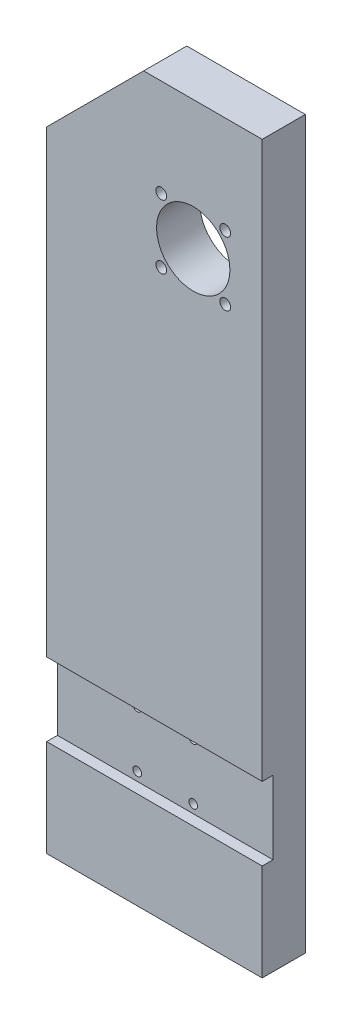
ISO-10303-21;
HEADER;
FILE_DESCRIPTION(('STEP AP214'),'2;1');
FILE_NAME('part.step','',(''),(''),'','','');
FILE_SCHEMA(('AUTOMOTIVE_DESIGN { 1 0 10303 214 1 1 1 1 }'));
ENDSEC;
DATA;
#1=APPLICATION_CONTEXT('core data for automotive mechanical design processes');
#2=APPLICATION_PROTOCOL_DEFINITION('international standard','automotive_design',2000,#1);
#3=PRODUCT_CONTEXT('',#1,'mechanical');
#4=PRODUCT('Part','Part','',(#3));
#5=PRODUCT_RELATED_PRODUCT_CATEGORY('part','',(#4));
#6=PRODUCT_DEFINITION_FORMATION('','',#4);
#7=PRODUCT_DEFINITION_CONTEXT('part definition',#1,'design');
#8=PRODUCT_DEFINITION('design','',#6,#7);
#9=PRODUCT_DEFINITION_SHAPE('','',#8);
#10=(LENGTH_UNIT() NAMED_UNIT(*) SI_UNIT(.MILLI.,.METRE.));
#11=(NAMED_UNIT(*) PLANE_ANGLE_UNIT() SI_UNIT($,.RADIAN.));
#12=(NAMED_UNIT(*) SI_UNIT($,.STERADIAN.) SOLID_ANGLE_UNIT());
#13=UNCERTAINTY_MEASURE_WITH_UNIT(LENGTH_MEASURE(1.E-05),#10,'distance_accuracy_value','');
#14=(GEOMETRIC_REPRESENTATION_CONTEXT(3) GLOBAL_UNCERTAINTY_ASSIGNED_CONTEXT((#13)) GLOBAL_UNIT_ASSIGNED_CONTEXT((#10,
#11,#12)) REPRESENTATION_CONTEXT('',''));
#15=CARTESIAN_POINT('',(0.,0.,0.));
#16=DIRECTION('',(0.,0.,1.));
#17=DIRECTION('',(1.,0.,0.));
#18=AXIS2_PLACEMENT_3D('',#15,#16,#17);
#19=CARTESIAN_POINT('',(0.,0.,20.));
#20=DIRECTION('',(0.,0.,1.));
#21=DIRECTION('',(1.,0.,0.));
#22=AXIS2_PLACEMENT_3D('',#19,#20,#21);
#23=PLANE('',#22);
#24=DIRECTION('',(-1.,0.,0.));
#25=VECTOR('',#24,1.);
#26=CARTESIAN_POINT('',(97.704546062029,362.500370418681,20.));
#27=LINE('',#26,#25);
#28=CARTESIAN_POINT('',(97.704546062029,362.500370418681,20.));
#29=VERTEX_POINT('',#28);
#30=CARTESIAN_POINT('',(-2.29545393797106,362.500370418681,20.));
#31=VERTEX_POINT('',#30);
#32=EDGE_CURVE('E151',#29,#31,#27,.T.);
#33=ORIENTED_EDGE('',*,*,#32,.F.);
#34=DIRECTION('',(0.,1.,0.));
#35=VECTOR('',#34,1.);
#36=CARTESIAN_POINT('',(97.7045460620289,283.500370418681,20.));
#37=LINE('',#36,#35);
#38=CARTESIAN_POINT('',(97.7045460620289,620.500370418681,20.));
#39=VERTEX_POINT('',#38);
#40=EDGE_CURVE('E228',#29,#39,#37,.T.);
#41=ORIENTED_EDGE('',*,*,#40,.T.);
#42=DIRECTION('',(-1.,0.,0.));
#43=VECTOR('',#42,1.);
#44=CARTESIAN_POINT('',(97.7045460620289,620.500370418681,20.));
#45=LINE('',#44,#43);
#46=CARTESIAN_POINT('',(42.7045460620291,620.500370418681,20.));
#47=VERTEX_POINT('',#46);
#48=EDGE_CURVE('E232',#39,#47,#45,.T.);
#49=ORIENTED_EDGE('',*,*,#48,.T.);
#50=DIRECTION('',(0.707106781186548,0.707106781186547,0.));
#51=VECTOR('',#50,1.);
#52=CARTESIAN_POINT('',(-288.897912178326,288.897912178326,20.));
#53=LINE('',#52,#51);
#54=CARTESIAN_POINT('',(-2.29545393797102,575.500370418681,20.));
#55=VERTEX_POINT('',#54);
#56=EDGE_CURVE('E11',#47,#55,#53,.F.);
#57=ORIENTED_EDGE('',*,*,#56,.T.);
#58=DIRECTION('',(0.,-1.,0.));
#59=VECTOR('',#58,1.);
#60=CARTESIAN_POINT('',(-2.29545393797106,283.500370418681,20.));
#61=LINE('',#60,#59);
#62=EDGE_CURVE('E222',#55,#31,#61,.T.);
#63=ORIENTED_EDGE('',*,*,#62,.T.);
#64=EDGE_LOOP('',(#33,#41,#49,#57,#63));
#65=FACE_BOUND('',#64,.T.);
#66=CARTESIAN_POINT('',(50.8553036571114,545.651128013764,20.));
#67=DIRECTION('',(0.,0.,1.));
#68=DIRECTION('',(1.,0.,0.));
#69=AXIS2_PLACEMENT_3D('',#66,#67,#68);
#70=CIRCLE('',#69,2.5);
#71=CARTESIAN_POINT('',(53.3553036571114,545.651128013764,20.));
#72=VERTEX_POINT('',#71);
#73=EDGE_CURVE('E198',#72,#72,#70,.T.);
#74=ORIENTED_EDGE('',*,*,#73,.F.);
#75=EDGE_LOOP('',(#74));
#76=FACE_BOUND('',#75,.T.);
#77=CARTESIAN_POINT('',(80.5537884669465,575.349612823598,20.));
#78=DIRECTION('',(0.,0.,1.));
#79=DIRECTION('',(1.,0.,0.));
#80=AXIS2_PLACEMENT_3D('',#77,#78,#79);
#81=CIRCLE('',#80,2.50000000000001);
#82=CARTESIAN_POINT('',(83.0537884669465,575.349612823598,20.));
#83=VERTEX_POINT('',#82);
#84=EDGE_CURVE('E210',#83,#83,#81,.T.);
#85=ORIENTED_EDGE('',*,*,#84,.F.);
#86=EDGE_LOOP('',(#85));
#87=FACE_BOUND('',#86,.T.);
#88=CARTESIAN_POINT('',(65.7045460620289,560.500370418681,20.));
#89=DIRECTION('',(0.,0.,1.));
#90=DIRECTION('',(1.,0.,0.));
#91=AXIS2_PLACEMENT_3D('',#88,#89,#90);
#92=CIRCLE('',#91,17.0000000000001);
#93=CARTESIAN_POINT('',(82.704546062029,560.500370418681,20.));
#94=VERTEX_POINT('',#93);
#95=EDGE_CURVE('E216',#94,#94,#92,.T.);
#96=ORIENTED_EDGE('',*,*,#95,.F.);
#97=EDGE_LOOP('',(#96));
#98=FACE_BOUND('',#97,.T.);
#99=CARTESIAN_POINT('',(80.5537884669465,545.651128013764,20.));
#100=DIRECTION('',(0.,0.,1.));
#101=DIRECTION('',(1.,0.,0.));
#102=AXIS2_PLACEMENT_3D('',#99,#100,#101);
#103=CIRCLE('',#102,2.50000000000001);
#104=CARTESIAN_POINT('',(83.0537884669465,545.651128013764,20.));
#105=VERTEX_POINT('',#104);
#106=EDGE_CURVE('E204',#105,#105,#103,.T.);
#107=ORIENTED_EDGE('',*,*,#106,.F.);
#108=EDGE_LOOP('',(#107));
#109=FACE_BOUND('',#108,.T.);
#110=CARTESIAN_POINT('',(50.8553036571114,575.349612823598,20.));
#111=DIRECTION('',(0.,0.,1.));
#112=DIRECTION('',(1.,0.,0.));
#113=AXIS2_PLACEMENT_3D('',#110,#111,#112);
#114=CIRCLE('',#113,2.50000000000003);
#115=CARTESIAN_POINT('',(53.3553036571114,575.349612823598,20.));
#116=VERTEX_POINT('',#115);
#117=EDGE_CURVE('E192',#116,#116,#114,.T.);
#118=ORIENTED_EDGE('',*,*,#117,.F.);
#119=EDGE_LOOP('',(#118));
#120=FACE_BOUND('',#119,.T.);
#121=ADVANCED_FACE('F33',(#65,#76,#87,#98,#109,#120),#23,.T.);
#122=CARTESIAN_POINT('',(34.7045460620289,358.500370418681,20.));
#123=DIRECTION('',(0.,0.,-1.));
#124=DIRECTION('',(-1.,0.,0.));
#125=AXIS2_PLACEMENT_3D('',#122,#123,#124);
#126=CYLINDRICAL_SURFACE('',#125,2.00000000000001);
#127=CARTESIAN_POINT('',(34.7045460620289,358.500370418681,0.));
#128=DIRECTION('',(0.,0.,1.));
#129=DIRECTION('',(1.,0.,0.));
#130=AXIS2_PLACEMENT_3D('',#127,#128,#129);
#131=CIRCLE('',#130,2.00000000000001);
#132=CARTESIAN_POINT('',(36.7045460620289,358.500370418681,0.));
#133=VERTEX_POINT('',#132);
#134=EDGE_CURVE('E188',#133,#133,#131,.T.);
#135=ORIENTED_EDGE('',*,*,#134,.F.);
#136=EDGE_LOOP('',(#135));
#137=FACE_BOUND('',#136,.T.);
#138=CARTESIAN_POINT('',(34.7045460620289,358.500370418681,15.));
#139=DIRECTION('',(0.,0.,1.));
#140=DIRECTION('',(1.,0.,0.));
#141=AXIS2_PLACEMENT_3D('',#138,#139,#140);
#142=CIRCLE('',#141,2.00000000000001);
#143=CARTESIAN_POINT('',(36.7045460620289,358.500370418681,15.));
#144=VERTEX_POINT('',#143);
#145=EDGE_CURVE('E176',#144,#144,#142,.T.);
#146=ORIENTED_EDGE('',*,*,#145,.T.);
#147=EDGE_LOOP('',(#146));
#148=FACE_BOUND('',#147,.T.);
#149=ADVANCED_FACE('F308',(#137,#148),#126,.F.);
#150=CARTESIAN_POINT('',(60.7045460620289,358.500370418681,20.));
#151=DIRECTION('',(0.,0.,-1.));
#152=DIRECTION('',(-1.,0.,0.));
#153=AXIS2_PLACEMENT_3D('',#150,#151,#152);
#154=CYLINDRICAL_SURFACE('',#153,2.);
#155=CARTESIAN_POINT('',(60.7045460620289,358.500370418681,0.));
#156=DIRECTION('',(0.,0.,1.));
#157=DIRECTION('',(-1.,0.,0.));
#158=AXIS2_PLACEMENT_3D('',#155,#156,#157);
#159=CIRCLE('',#158,2.);
#160=CARTESIAN_POINT('',(58.7045460620289,358.500370418681,0.));
#161=VERTEX_POINT('',#160);
#162=EDGE_CURVE('E185',#161,#161,#159,.T.);
#163=ORIENTED_EDGE('',*,*,#162,.F.);
#164=EDGE_LOOP('',(#163));
#165=FACE_BOUND('',#164,.T.);
#166=CARTESIAN_POINT('',(60.7045460620289,358.500370418681,15.));
#167=DIRECTION('',(0.,0.,1.));
#168=DIRECTION('',(1.,0.,0.));
#169=AXIS2_PLACEMENT_3D('',#166,#167,#168);
#170=CIRCLE('',#169,2.);
#171=CARTESIAN_POINT('',(62.7045460620289,358.500370418681,15.));
#172=VERTEX_POINT('',#171);
#173=EDGE_CURVE('E173',#172,#172,#170,.T.);
#174=ORIENTED_EDGE('',*,*,#173,.T.);
#175=EDGE_LOOP('',(#174));
#176=FACE_BOUND('',#175,.T.);
#177=ADVANCED_FACE('F313',(#165,#176),#154,.F.);
#178=CARTESIAN_POINT('',(60.7045460620289,332.500370418681,20.));
#179=DIRECTION('',(0.,0.,-1.));
#180=DIRECTION('',(-1.,0.,0.));
#181=AXIS2_PLACEMENT_3D('',#178,#179,#180);
#182=CYLINDRICAL_SURFACE('',#181,2.);
#183=CARTESIAN_POINT('',(60.7045460620289,332.500370418681,0.));
#184=DIRECTION('',(0.,0.,1.));
#185=DIRECTION('',(1.,0.,0.));
#186=AXIS2_PLACEMENT_3D('',#183,#184,#185);
#187=CIRCLE('',#186,2.);
#188=CARTESIAN_POINT('',(62.7045460620289,332.500370418681,0.));
#189=VERTEX_POINT('',#188);
#190=EDGE_CURVE('E182',#189,#189,#187,.T.);
#191=ORIENTED_EDGE('',*,*,#190,.F.);
#192=EDGE_LOOP('',(#191));
#193=FACE_BOUND('',#192,.T.);
#194=CARTESIAN_POINT('',(60.7045460620289,332.500370418681,15.));
#195=DIRECTION('',(0.,0.,1.));
#196=DIRECTION('',(1.,0.,0.));
#197=AXIS2_PLACEMENT_3D('',#194,#195,#196);
#198=CIRCLE('',#197,2.);
#199=CARTESIAN_POINT('',(62.7045460620289,332.500370418681,15.));
#200=VERTEX_POINT('',#199);
#201=EDGE_CURVE('E170',#200,#200,#198,.T.);
#202=ORIENTED_EDGE('',*,*,#201,.T.);
#203=EDGE_LOOP('',(#202));
#204=FACE_BOUND('',#203,.T.);
#205=ADVANCED_FACE('F324',(#193,#204),#182,.F.);
#206=CARTESIAN_POINT('',(34.7045460620289,332.500370418681,20.));
#207=DIRECTION('',(0.,0.,-1.));
#208=DIRECTION('',(-1.,0.,0.));
#209=AXIS2_PLACEMENT_3D('',#206,#207,#208);
#210=CYLINDRICAL_SURFACE('',#209,2.00000000000001);
#211=CARTESIAN_POINT('',(34.7045460620289,332.500370418681,0.));
#212=DIRECTION('',(0.,0.,1.));
#213=DIRECTION('',(-1.,0.,0.));
#214=AXIS2_PLACEMENT_3D('',#211,#212,#213);
#215=CIRCLE('',#214,2.00000000000001);
#216=CARTESIAN_POINT('',(32.7045460620289,332.500370418681,0.));
#217=VERTEX_POINT('',#216);
#218=EDGE_CURVE('E179',#217,#217,#215,.T.);
#219=ORIENTED_EDGE('',*,*,#218,.F.);
#220=EDGE_LOOP('',(#219));
#221=FACE_BOUND('',#220,.T.);
#222=CARTESIAN_POINT('',(34.7045460620289,332.500370418681,15.));
#223=DIRECTION('',(0.,0.,1.));
#224=DIRECTION('',(1.,0.,0.));
#225=AXIS2_PLACEMENT_3D('',#222,#223,#224);
#226=CIRCLE('',#225,2.00000000000001);
#227=CARTESIAN_POINT('',(36.7045460620289,332.500370418681,15.));
#228=VERTEX_POINT('',#227);
#229=EDGE_CURVE('E37',#228,#228,#226,.T.);
#230=ORIENTED_EDGE('',*,*,#229,.T.);
#231=EDGE_LOOP('',(#230));
#232=FACE_BOUND('',#231,.T.);
#233=ADVANCED_FACE('F319',(#221,#232),#210,.F.);
#234=DIRECTION('',(1.,0.,0.));
#235=VECTOR('',#234,1.);
#236=CARTESIAN_POINT('',(97.7045460620289,328.500370418681,20.));
#237=LINE('',#236,#235);
#238=CARTESIAN_POINT('',(-2.29545393797106,328.500370418681,20.));
#239=VERTEX_POINT('',#238);
#240=CARTESIAN_POINT('',(97.7045460620289,328.500370418681,20.));
#241=VERTEX_POINT('',#240);
#242=EDGE_CURVE('E148',#239,#241,#237,.T.);
#243=ORIENTED_EDGE('',*,*,#242,.F.);
#244=CARTESIAN_POINT('',(-2.29545393797106,283.500370418681,20.));
#245=VERTEX_POINT('',#244);
#246=EDGE_CURVE('E226',#239,#245,#61,.T.);
#247=ORIENTED_EDGE('',*,*,#246,.T.);
#248=DIRECTION('',(1.,0.,0.));
#249=VECTOR('',#248,1.);
#250=CARTESIAN_POINT('',(97.7045460620289,283.500370418681,20.));
#251=LINE('',#250,#249);
#252=CARTESIAN_POINT('',(97.7045460620289,283.500370418681,20.));
#253=VERTEX_POINT('',#252);
#254=EDGE_CURVE('E225',#245,#253,#251,.T.);
#255=ORIENTED_EDGE('',*,*,#254,.T.);
#256=EDGE_CURVE('E229',#253,#241,#37,.T.);
#257=ORIENTED_EDGE('',*,*,#256,.T.);
#258=EDGE_LOOP('',(#243,#247,#255,#257));
#259=FACE_BOUND('',#258,.T.);
#260=ADVANCED_FACE('F293',(#259),#23,.T.);
#261=CARTESIAN_POINT('',(0.,0.,0.));
#262=DIRECTION('',(0.,0.,1.));
#263=DIRECTION('',(1.,0.,0.));
#264=AXIS2_PLACEMENT_3D('',#261,#262,#263);
#265=PLANE('',#264);
#266=DIRECTION('',(0.,-1.,0.));
#267=VECTOR('',#266,1.);
#268=CARTESIAN_POINT('',(-2.29545393797106,283.500370418681,0.));
#269=LINE('',#268,#267);
#270=CARTESIAN_POINT('',(-2.29545393797106,575.500370418681,0.));
#271=VERTEX_POINT('',#270);
#272=CARTESIAN_POINT('',(-2.29545393797106,283.500370418681,0.));
#273=VERTEX_POINT('',#272);
#274=EDGE_CURVE('E219',#271,#273,#269,.T.);
#275=ORIENTED_EDGE('',*,*,#274,.F.);
#276=DIRECTION('',(-0.707106781186548,-0.707106781186547,0.));
#277=VECTOR('',#276,1.);
#278=CARTESIAN_POINT('',(-2.29545393797106,575.500370418681,0.));
#279=LINE('',#278,#277);
#280=CARTESIAN_POINT('',(42.704546062029,620.500370418681,0.));
#281=VERTEX_POINT('',#280);
#282=EDGE_CURVE('E253',#271,#281,#279,.F.);
#283=ORIENTED_EDGE('',*,*,#282,.T.);
#284=DIRECTION('',(-1.,0.,0.));
#285=VECTOR('',#284,1.);
#286=CARTESIAN_POINT('',(97.7045460620289,620.500370418681,0.));
#287=LINE('',#286,#285);
#288=CARTESIAN_POINT('',(97.7045460620289,620.500370418681,0.));
#289=VERTEX_POINT('',#288);
#290=EDGE_CURVE('E240',#289,#281,#287,.T.);
#291=ORIENTED_EDGE('',*,*,#290,.F.);
#292=DIRECTION('',(0.,1.,0.));
#293=VECTOR('',#292,1.);
#294=CARTESIAN_POINT('',(97.7045460620289,283.500370418681,0.));
#295=LINE('',#294,#293);
#296=CARTESIAN_POINT('',(97.7045460620289,283.500370418681,0.));
#297=VERTEX_POINT('',#296);
#298=EDGE_CURVE('E238',#297,#289,#295,.T.);
#299=ORIENTED_EDGE('',*,*,#298,.F.);
#300=DIRECTION('',(1.,0.,0.));
#301=VECTOR('',#300,1.);
#302=CARTESIAN_POINT('',(97.7045460620289,283.500370418681,0.));
#303=LINE('',#302,#301);
#304=EDGE_CURVE('E236',#273,#297,#303,.T.);
#305=ORIENTED_EDGE('',*,*,#304,.F.);
#306=EDGE_LOOP('',(#275,#283,#291,#299,#305));
#307=FACE_BOUND('',#306,.T.);
#308=CARTESIAN_POINT('',(65.7045460620289,560.500370418681,0.));
#309=DIRECTION('',(0.,0.,1.));
#310=DIRECTION('',(1.,0.,0.));
#311=AXIS2_PLACEMENT_3D('',#308,#309,#310);
#312=CIRCLE('',#311,17.0000000000001);
#313=CARTESIAN_POINT('',(82.704546062029,560.500370418681,0.));
#314=VERTEX_POINT('',#313);
#315=EDGE_CURVE('E213',#314,#314,#312,.T.);
#316=ORIENTED_EDGE('',*,*,#315,.T.);
#317=EDGE_LOOP('',(#316));
#318=FACE_BOUND('',#317,.T.);
#319=CARTESIAN_POINT('',(80.5537884669465,575.349612823598,0.));
#320=DIRECTION('',(0.,0.,1.));
#321=DIRECTION('',(1.,0.,0.));
#322=AXIS2_PLACEMENT_3D('',#319,#320,#321);
#323=CIRCLE('',#322,2.50000000000001);
#324=CARTESIAN_POINT('',(83.0537884669465,575.349612823598,0.));
#325=VERTEX_POINT('',#324);
#326=EDGE_CURVE('E207',#325,#325,#323,.T.);
#327=ORIENTED_EDGE('',*,*,#326,.T.);
#328=EDGE_LOOP('',(#327));
#329=FACE_BOUND('',#328,.T.);
#330=CARTESIAN_POINT('',(80.5537884669465,545.651128013764,0.));
#331=DIRECTION('',(0.,0.,1.));
#332=DIRECTION('',(1.,0.,0.));
#333=AXIS2_PLACEMENT_3D('',#330,#331,#332);
#334=CIRCLE('',#333,2.50000000000001);
#335=CARTESIAN_POINT('',(83.0537884669465,545.651128013764,0.));
#336=VERTEX_POINT('',#335);
#337=EDGE_CURVE('E201',#336,#336,#334,.T.);
#338=ORIENTED_EDGE('',*,*,#337,.T.);
#339=EDGE_LOOP('',(#338));
#340=FACE_BOUND('',#339,.T.);
#341=CARTESIAN_POINT('',(50.8553036571114,545.651128013764,0.));
#342=DIRECTION('',(0.,0.,1.));
#343=DIRECTION('',(1.,0.,0.));
#344=AXIS2_PLACEMENT_3D('',#341,#342,#343);
#345=CIRCLE('',#344,2.5);
#346=CARTESIAN_POINT('',(53.3553036571114,545.651128013764,0.));
#347=VERTEX_POINT('',#346);
#348=EDGE_CURVE('E195',#347,#347,#345,.T.);
#349=ORIENTED_EDGE('',*,*,#348,.T.);
#350=EDGE_LOOP('',(#349));
#351=FACE_BOUND('',#350,.T.);
#352=CARTESIAN_POINT('',(50.8553036571114,575.349612823598,0.));
#353=DIRECTION('',(0.,0.,1.));
#354=DIRECTION('',(1.,0.,0.));
#355=AXIS2_PLACEMENT_3D('',#352,#353,#354);
#356=CIRCLE('',#355,2.50000000000003);
#357=CARTESIAN_POINT('',(53.3553036571114,575.349612823598,0.));
#358=VERTEX_POINT('',#357);
#359=EDGE_CURVE('E191',#358,#358,#356,.T.);
#360=ORIENTED_EDGE('',*,*,#359,.T.);
#361=EDGE_LOOP('',(#360));
#362=FACE_BOUND('',#361,.T.);
#363=ORIENTED_EDGE('',*,*,#134,.T.);
#364=EDGE_LOOP('',(#363));
#365=FACE_BOUND('',#364,.T.);
#366=ORIENTED_EDGE('',*,*,#162,.T.);
#367=EDGE_LOOP('',(#366));
#368=FACE_BOUND('',#367,.T.);
#369=ORIENTED_EDGE('',*,*,#190,.T.);
#370=EDGE_LOOP('',(#369));
#371=FACE_BOUND('',#370,.T.);
#372=ORIENTED_EDGE('',*,*,#218,.T.);
#373=EDGE_LOOP('',(#372));
#374=FACE_BOUND('',#373,.T.);
#375=ADVANCED_FACE('F258',(#307,#318,#329,#340,#351,#362,#365,#368,#371,#374),#265,.F.);
#376=CARTESIAN_POINT('',(-2.29545393797106,283.500370418681,20.));
#377=DIRECTION('',(1.,0.,0.));
#378=DIRECTION('',(0.,0.,-1.));
#379=AXIS2_PLACEMENT_3D('',#376,#377,#378);
#380=PLANE('',#379);
#381=DIRECTION('',(0.,-1.,0.));
#382=VECTOR('',#381,1.);
#383=CARTESIAN_POINT('',(-2.29545393797106,328.500370418681,15.));
#384=LINE('',#383,#382);
#385=CARTESIAN_POINT('',(-2.29545393797106,362.500370418681,15.));
#386=VERTEX_POINT('',#385);
#387=CARTESIAN_POINT('',(-2.29545393797106,328.500370418681,15.));
#388=VERTEX_POINT('',#387);
#389=EDGE_CURVE('E149',#386,#388,#384,.T.);
#390=ORIENTED_EDGE('',*,*,#389,.F.);
#391=DIRECTION('',(0.,0.,1.));
#392=VECTOR('',#391,1.);
#393=CARTESIAN_POINT('',(-2.29545393797106,362.500370418681,15.));
#394=LINE('',#393,#392);
#395=EDGE_CURVE('E161',#386,#31,#394,.T.);
#396=ORIENTED_EDGE('',*,*,#395,.T.);
#397=ORIENTED_EDGE('',*,*,#62,.F.);
#398=DIRECTION('',(0.,0.,-1.));
#399=VECTOR('',#398,1.);
#400=CARTESIAN_POINT('',(-2.29545393797106,575.500370418681,20.));
#401=LINE('',#400,#399);
#402=EDGE_CURVE('E250',#55,#271,#401,.T.);
#403=ORIENTED_EDGE('',*,*,#402,.T.);
#404=ORIENTED_EDGE('',*,*,#274,.T.);
#405=DIRECTION('',(0.,0.,-1.));
#406=VECTOR('',#405,1.);
#407=CARTESIAN_POINT('',(-2.29545393797106,283.500370418681,20.));
#408=LINE('',#407,#406);
#409=EDGE_CURVE('E247',#245,#273,#408,.T.);
#410=ORIENTED_EDGE('',*,*,#409,.F.);
#411=ORIENTED_EDGE('',*,*,#246,.F.);
#412=DIRECTION('',(0.,0.,1.));
#413=VECTOR('',#412,1.);
#414=CARTESIAN_POINT('',(-2.29545393797106,328.500370418681,15.));
#415=LINE('',#414,#413);
#416=EDGE_CURVE('E158',#388,#239,#415,.T.);
#417=ORIENTED_EDGE('',*,*,#416,.F.);
#418=EDGE_LOOP('',(#390,#396,#397,#403,#404,#410,#411,#417));
#419=FACE_BOUND('',#418,.T.);
#420=ADVANCED_FACE('F273',(#419),#380,.F.);
#421=CARTESIAN_POINT('',(97.7045460620289,283.500370418681,20.));
#422=DIRECTION('',(0.,1.,0.));
#423=DIRECTION('',(0.,0.,1.));
#424=AXIS2_PLACEMENT_3D('',#421,#422,#423);
#425=PLANE('',#424);
#426=CARTESIAN_POINT('',(7.70454606202894,283.500370418681,10.));
#427=DIRECTION('',(0.,-1.,0.));
#428=DIRECTION('',(0.,0.,-1.));
#429=AXIS2_PLACEMENT_3D('',#426,#427,#428);
#430=CIRCLE('',#429,1.64999999999999);
#431=CARTESIAN_POINT('',(7.70454606202894,283.500370418681,8.35000000000001));
#432=VERTEX_POINT('',#431);
#433=EDGE_CURVE('E126',#432,#432,#430,.T.);
#434=ORIENTED_EDGE('',*,*,#433,.F.);
#435=EDGE_LOOP('',(#434));
#436=FACE_BOUND('',#435,.T.);
#437=CARTESIAN_POINT('',(27.7045460620289,283.500370418681,10.));
#438=DIRECTION('',(0.,-1.,0.));
#439=DIRECTION('',(0.,0.,-1.));
#440=AXIS2_PLACEMENT_3D('',#437,#438,#439);
#441=CIRCLE('',#440,1.64999999999999);
#442=CARTESIAN_POINT('',(27.7045460620289,283.500370418681,8.35000000000001));
#443=VERTEX_POINT('',#442);
#444=EDGE_CURVE('E125',#443,#443,#441,.T.);
#445=ORIENTED_EDGE('',*,*,#444,.F.);
#446=EDGE_LOOP('',(#445));
#447=FACE_BOUND('',#446,.T.);
#448=CARTESIAN_POINT('',(67.7045460620289,283.500370418681,10.));
#449=DIRECTION('',(0.,-1.,0.));
#450=DIRECTION('',(0.,0.,-1.));
#451=AXIS2_PLACEMENT_3D('',#448,#449,#450);
#452=CIRCLE('',#451,1.64999999999998);
#453=CARTESIAN_POINT('',(67.7045460620289,283.500370418681,8.35000000000002));
#454=VERTEX_POINT('',#453);
#455=EDGE_CURVE('E136',#454,#454,#452,.T.);
#456=ORIENTED_EDGE('',*,*,#455,.F.);
#457=EDGE_LOOP('',(#456));
#458=FACE_BOUND('',#457,.T.);
#459=CARTESIAN_POINT('',(87.7045460620289,283.500370418681,10.));
#460=DIRECTION('',(0.,-1.,0.));
#461=DIRECTION('',(0.,0.,-1.));
#462=AXIS2_PLACEMENT_3D('',#459,#460,#461);
#463=CIRCLE('',#462,1.64999999999998);
#464=CARTESIAN_POINT('',(87.7045460620289,283.500370418681,8.35000000000002));
#465=VERTEX_POINT('',#464);
#466=EDGE_CURVE('E142',#465,#465,#463,.T.);
#467=ORIENTED_EDGE('',*,*,#466,.F.);
#468=EDGE_LOOP('',(#467));
#469=FACE_BOUND('',#468,.T.);
#470=ORIENTED_EDGE('',*,*,#304,.T.);
#471=DIRECTION('',(0.,0.,-1.));
#472=VECTOR('',#471,1.);
#473=CARTESIAN_POINT('',(97.7045460620289,283.500370418681,20.));
#474=LINE('',#473,#472);
#475=EDGE_CURVE('E244',#253,#297,#474,.T.);
#476=ORIENTED_EDGE('',*,*,#475,.F.);
#477=ORIENTED_EDGE('',*,*,#254,.F.);
#478=ORIENTED_EDGE('',*,*,#409,.T.);
#479=EDGE_LOOP('',(#470,#476,#477,#478));
#480=FACE_BOUND('',#479,.T.);
#481=ADVANCED_FACE('F289',(#436,#447,#458,#469,#480),#425,.F.);
#482=CARTESIAN_POINT('',(97.7045460620289,283.500370418681,20.));
#483=DIRECTION('',(-1.,0.,0.));
#484=DIRECTION('',(0.,0.,1.));
#485=AXIS2_PLACEMENT_3D('',#482,#483,#484);
#486=PLANE('',#485);
#487=ORIENTED_EDGE('',*,*,#40,.F.);
#488=DIRECTION('',(0.,0.,1.));
#489=VECTOR('',#488,1.);
#490=CARTESIAN_POINT('',(97.704546062029,362.500370418681,15.));
#491=LINE('',#490,#489);
#492=CARTESIAN_POINT('',(97.704546062029,362.500370418681,15.));
#493=VERTEX_POINT('',#492);
#494=EDGE_CURVE('E164',#493,#29,#491,.T.);
#495=ORIENTED_EDGE('',*,*,#494,.F.);
#496=DIRECTION('',(0.,1.,0.));
#497=VECTOR('',#496,1.);
#498=CARTESIAN_POINT('',(97.7045460620289,328.500370418681,15.));
#499=LINE('',#498,#497);
#500=CARTESIAN_POINT('',(97.7045460620289,328.500370418681,15.));
#501=VERTEX_POINT('',#500);
#502=EDGE_CURVE('E153',#501,#493,#499,.T.);
#503=ORIENTED_EDGE('',*,*,#502,.F.);
#504=DIRECTION('',(0.,0.,1.));
#505=VECTOR('',#504,1.);
#506=CARTESIAN_POINT('',(97.7045460620289,328.500370418681,15.));
#507=LINE('',#506,#505);
#508=EDGE_CURVE('E166',#501,#241,#507,.T.);
#509=ORIENTED_EDGE('',*,*,#508,.T.);
#510=ORIENTED_EDGE('',*,*,#256,.F.);
#511=ORIENTED_EDGE('',*,*,#475,.T.);
#512=ORIENTED_EDGE('',*,*,#298,.T.);
#513=DIRECTION('',(0.,0.,-1.));
#514=VECTOR('',#513,1.);
#515=CARTESIAN_POINT('',(97.7045460620289,620.500370418681,20.));
#516=LINE('',#515,#514);
#517=EDGE_CURVE('E234',#39,#289,#516,.T.);
#518=ORIENTED_EDGE('',*,*,#517,.F.);
#519=EDGE_LOOP('',(#487,#495,#503,#509,#510,#511,#512,#518));
#520=FACE_BOUND('',#519,.T.);
#521=ADVANCED_FACE('F283',(#520),#486,.F.);
#522=CARTESIAN_POINT('',(97.7045460620289,620.500370418681,20.));
#523=DIRECTION('',(0.,-1.,0.));
#524=DIRECTION('',(0.,0.,-1.));
#525=AXIS2_PLACEMENT_3D('',#522,#523,#524);
#526=PLANE('',#525);
#527=ORIENTED_EDGE('',*,*,#290,.T.);
#528=DIRECTION('',(0.,0.,1.));
#529=VECTOR('',#528,1.);
#530=CARTESIAN_POINT('',(42.704546062029,620.500370418681,20.));
#531=LINE('',#530,#529);
#532=EDGE_CURVE('E42',#281,#47,#531,.T.);
#533=ORIENTED_EDGE('',*,*,#532,.T.);
#534=ORIENTED_EDGE('',*,*,#48,.F.);
#535=ORIENTED_EDGE('',*,*,#517,.T.);
#536=EDGE_LOOP('',(#527,#533,#534,#535));
#537=FACE_BOUND('',#536,.T.);
#538=ADVANCED_FACE('F264',(#537),#526,.F.);
#539=CARTESIAN_POINT('',(65.7045460620289,560.500370418681,20.));
#540=DIRECTION('',(0.,0.,-1.));
#541=DIRECTION('',(-1.,0.,0.));
#542=AXIS2_PLACEMENT_3D('',#539,#540,#541);
#543=CYLINDRICAL_SURFACE('',#542,17.0000000000001);
#544=ORIENTED_EDGE('',*,*,#95,.T.);
#545=EDGE_LOOP('',(#544));
#546=FACE_BOUND('',#545,.T.);
#547=ORIENTED_EDGE('',*,*,#315,.F.);
#548=EDGE_LOOP('',(#547));
#549=FACE_BOUND('',#548,.T.);
#550=ADVANCED_FACE('F351',(#546,#549),#543,.F.);
#551=CARTESIAN_POINT('',(80.5537884669465,575.349612823598,20.));
#552=DIRECTION('',(0.,0.,-1.));
#553=DIRECTION('',(-1.,0.,0.));
#554=AXIS2_PLACEMENT_3D('',#551,#552,#553);
#555=CYLINDRICAL_SURFACE('',#554,2.50000000000001);
#556=ORIENTED_EDGE('',*,*,#84,.T.);
#557=EDGE_LOOP('',(#556));
#558=FACE_BOUND('',#557,.T.);
#559=ORIENTED_EDGE('',*,*,#326,.F.);
#560=EDGE_LOOP('',(#559));
#561=FACE_BOUND('',#560,.T.);
#562=ADVANCED_FACE('F348',(#558,#561),#555,.F.);
#563=CARTESIAN_POINT('',(80.5537884669465,545.651128013764,20.));
#564=DIRECTION('',(0.,0.,-1.));
#565=DIRECTION('',(-1.,0.,0.));
#566=AXIS2_PLACEMENT_3D('',#563,#564,#565);
#567=CYLINDRICAL_SURFACE('',#566,2.50000000000001);
#568=ORIENTED_EDGE('',*,*,#106,.T.);
#569=EDGE_LOOP('',(#568));
#570=FACE_BOUND('',#569,.T.);
#571=ORIENTED_EDGE('',*,*,#337,.F.);
#572=EDGE_LOOP('',(#571));
#573=FACE_BOUND('',#572,.T.);
#574=ADVANCED_FACE('F344',(#570,#573),#567,.F.);
#575=CARTESIAN_POINT('',(50.8553036571114,545.651128013764,20.));
#576=DIRECTION('',(0.,0.,-1.));
#577=DIRECTION('',(-1.,0.,0.));
#578=AXIS2_PLACEMENT_3D('',#575,#576,#577);
#579=CYLINDRICAL_SURFACE('',#578,2.5);
#580=ORIENTED_EDGE('',*,*,#73,.T.);
#581=EDGE_LOOP('',(#580));
#582=FACE_BOUND('',#581,.T.);
#583=ORIENTED_EDGE('',*,*,#348,.F.);
#584=EDGE_LOOP('',(#583));
#585=FACE_BOUND('',#584,.T.);
#586=ADVANCED_FACE('F340',(#582,#585),#579,.F.);
#587=CARTESIAN_POINT('',(50.8553036571114,575.349612823598,20.));
#588=DIRECTION('',(0.,0.,-1.));
#589=DIRECTION('',(-1.,0.,0.));
#590=AXIS2_PLACEMENT_3D('',#587,#588,#589);
#591=CYLINDRICAL_SURFACE('',#590,2.50000000000003);
#592=ORIENTED_EDGE('',*,*,#117,.T.);
#593=EDGE_LOOP('',(#592));
#594=FACE_BOUND('',#593,.T.);
#595=ORIENTED_EDGE('',*,*,#359,.F.);
#596=EDGE_LOOP('',(#595));
#597=FACE_BOUND('',#596,.T.);
#598=ADVANCED_FACE('F337',(#594,#597),#591,.F.);
#599=CARTESIAN_POINT('',(-2.29545393797106,575.500370418681,20.));
#600=DIRECTION('',(0.707106781186547,-0.707106781186548,0.));
#601=DIRECTION('',(0.,0.,-1.));
#602=AXIS2_PLACEMENT_3D('',#599,#600,#601);
#603=PLANE('',#602);
#604=ORIENTED_EDGE('',*,*,#56,.F.);
#605=ORIENTED_EDGE('',*,*,#532,.F.);
#606=ORIENTED_EDGE('',*,*,#282,.F.);
#607=ORIENTED_EDGE('',*,*,#402,.F.);
#608=EDGE_LOOP('',(#604,#605,#606,#607));
#609=FACE_BOUND('',#608,.T.);
#610=ADVANCED_FACE('F35',(#609),#603,.F.);
#611=CARTESIAN_POINT('',(97.704546062029,362.500370418681,15.));
#612=DIRECTION('',(0.,1.,0.));
#613=DIRECTION('',(0.,0.,1.));
#614=AXIS2_PLACEMENT_3D('',#611,#612,#613);
#615=PLANE('',#614);
#616=ORIENTED_EDGE('',*,*,#32,.T.);
#617=ORIENTED_EDGE('',*,*,#395,.F.);
#618=DIRECTION('',(-1.,0.,0.));
#619=VECTOR('',#618,1.);
#620=CARTESIAN_POINT('',(97.704546062029,362.500370418681,15.));
#621=LINE('',#620,#619);
#622=EDGE_CURVE('E155',#493,#386,#621,.T.);
#623=ORIENTED_EDGE('',*,*,#622,.F.);
#624=ORIENTED_EDGE('',*,*,#494,.T.);
#625=EDGE_LOOP('',(#616,#617,#623,#624));
#626=FACE_BOUND('',#625,.T.);
#627=ADVANCED_FACE('F277',(#626),#615,.F.);
#628=CARTESIAN_POINT('',(97.7045460620289,328.500370418681,15.));
#629=DIRECTION('',(0.,-1.,0.));
#630=DIRECTION('',(0.,0.,-1.));
#631=AXIS2_PLACEMENT_3D('',#628,#629,#630);
#632=PLANE('',#631);
#633=ORIENTED_EDGE('',*,*,#242,.T.);
#634=ORIENTED_EDGE('',*,*,#508,.F.);
#635=DIRECTION('',(1.,0.,0.));
#636=VECTOR('',#635,1.);
#637=CARTESIAN_POINT('',(97.7045460620289,328.500370418681,15.));
#638=LINE('',#637,#636);
#639=EDGE_CURVE('E49',#388,#501,#638,.T.);
#640=ORIENTED_EDGE('',*,*,#639,.F.);
#641=ORIENTED_EDGE('',*,*,#416,.T.);
#642=EDGE_LOOP('',(#633,#634,#640,#641));
#643=FACE_BOUND('',#642,.T.);
#644=ADVANCED_FACE('F295',(#643),#632,.F.);
#645=CARTESIAN_POINT('',(0.,0.,15.));
#646=DIRECTION('',(0.,0.,1.));
#647=DIRECTION('',(1.,0.,0.));
#648=AXIS2_PLACEMENT_3D('',#645,#646,#647);
#649=PLANE('',#648);
#650=ORIENTED_EDGE('',*,*,#145,.F.);
#651=EDGE_LOOP('',(#650));
#652=FACE_BOUND('',#651,.T.);
#653=ORIENTED_EDGE('',*,*,#173,.F.);
#654=EDGE_LOOP('',(#653));
#655=FACE_BOUND('',#654,.T.);
#656=ORIENTED_EDGE('',*,*,#201,.F.);
#657=EDGE_LOOP('',(#656));
#658=FACE_BOUND('',#657,.T.);
#659=ORIENTED_EDGE('',*,*,#229,.F.);
#660=EDGE_LOOP('',(#659));
#661=FACE_BOUND('',#660,.T.);
#662=ORIENTED_EDGE('',*,*,#389,.T.);
#663=ORIENTED_EDGE('',*,*,#639,.T.);
#664=ORIENTED_EDGE('',*,*,#502,.T.);
#665=ORIENTED_EDGE('',*,*,#622,.T.);
#666=EDGE_LOOP('',(#662,#663,#664,#665));
#667=FACE_BOUND('',#666,.T.);
#668=ADVANCED_FACE('F279',(#652,#655,#658,#661,#667),#649,.T.);
#669=CARTESIAN_POINT('',(87.7045460620289,299.600370418681,10.));
#670=DIRECTION('',(0.,-1.,0.));
#671=DIRECTION('',(0.,0.,-1.));
#672=AXIS2_PLACEMENT_3D('',#669,#670,#671);
#673=CONICAL_SURFACE('',#672,1.64999999999998,1.02974425867666);
#674=CARTESIAN_POINT('',(87.7045460620289,300.591790440076,10.));
#675=VERTEX_POINT('',#674);
#676=VERTEX_LOOP('',#675);
#677=FACE_BOUND('',#676,.T.);
#678=CARTESIAN_POINT('',(87.7045460620289,299.600370418681,10.));
#679=DIRECTION('',(0.,-1.,0.));
#680=DIRECTION('',(0.,0.,-1.));
#681=AXIS2_PLACEMENT_3D('',#678,#679,#680);
#682=CIRCLE('',#681,1.64999999999998);
#683=CARTESIAN_POINT('',(87.7045460620289,299.600370418681,8.35000000000002));
#684=VERTEX_POINT('',#683);
#685=EDGE_CURVE('E145',#684,#684,#682,.T.);
#686=ORIENTED_EDGE('',*,*,#685,.T.);
#687=EDGE_LOOP('',(#686));
#688=FACE_BOUND('',#687,.T.);
#689=ADVANCED_FACE('F302',(#677,#688),#673,.F.);
#690=CARTESIAN_POINT('',(87.7045460620289,283.500370418681,10.));
#691=DIRECTION('',(0.,-1.,0.));
#692=DIRECTION('',(0.,0.,-1.));
#693=AXIS2_PLACEMENT_3D('',#690,#691,#692);
#694=CYLINDRICAL_SURFACE('',#693,1.64999999999998);
#695=ORIENTED_EDGE('',*,*,#685,.F.);
#696=EDGE_LOOP('',(#695));
#697=FACE_BOUND('',#696,.T.);
#698=ORIENTED_EDGE('',*,*,#466,.T.);
#699=EDGE_LOOP('',(#698));
#700=FACE_BOUND('',#699,.T.);
#701=ADVANCED_FACE('F447',(#697,#700),#694,.F.);
#702=CARTESIAN_POINT('',(67.7045460620289,299.600370418681,10.));
#703=DIRECTION('',(0.,-1.,0.));
#704=DIRECTION('',(0.,0.,-1.));
#705=AXIS2_PLACEMENT_3D('',#702,#703,#704);
#706=CONICAL_SURFACE('',#705,1.64999999999998,1.02974425867666);
#707=CARTESIAN_POINT('',(67.7045460620289,300.591790440076,10.));
#708=VERTEX_POINT('',#707);
#709=VERTEX_LOOP('',#708);
#710=FACE_BOUND('',#709,.T.);
#711=CARTESIAN_POINT('',(67.7045460620289,299.600370418681,10.));
#712=DIRECTION('',(0.,-1.,0.));
#713=DIRECTION('',(0.,0.,-1.));
#714=AXIS2_PLACEMENT_3D('',#711,#712,#713);
#715=CIRCLE('',#714,1.64999999999998);
#716=CARTESIAN_POINT('',(67.7045460620289,299.600370418681,8.35000000000002));
#717=VERTEX_POINT('',#716);
#718=EDGE_CURVE('E139',#717,#717,#715,.T.);
#719=ORIENTED_EDGE('',*,*,#718,.T.);
#720=EDGE_LOOP('',(#719));
#721=FACE_BOUND('',#720,.T.);
#722=ADVANCED_FACE('F454',(#710,#721),#706,.F.);
#723=CARTESIAN_POINT('',(67.7045460620289,283.500370418681,10.));
#724=DIRECTION('',(0.,-1.,0.));
#725=DIRECTION('',(0.,0.,-1.));
#726=AXIS2_PLACEMENT_3D('',#723,#724,#725);
#727=CYLINDRICAL_SURFACE('',#726,1.64999999999998);
#728=ORIENTED_EDGE('',*,*,#718,.F.);
#729=EDGE_LOOP('',(#728));
#730=FACE_BOUND('',#729,.T.);
#731=ORIENTED_EDGE('',*,*,#455,.T.);
#732=EDGE_LOOP('',(#731));
#733=FACE_BOUND('',#732,.T.);
#734=ADVANCED_FACE('F462',(#730,#733),#727,.F.);
#735=CARTESIAN_POINT('',(27.7045460620289,299.600370418681,10.));
#736=DIRECTION('',(0.,-1.,0.));
#737=DIRECTION('',(0.,0.,-1.));
#738=AXIS2_PLACEMENT_3D('',#735,#736,#737);
#739=CONICAL_SURFACE('',#738,1.64999999999998,1.02974425867666);
#740=CARTESIAN_POINT('',(27.7045460620289,300.591790440076,10.));
#741=VERTEX_POINT('',#740);
#742=VERTEX_LOOP('',#741);
#743=FACE_BOUND('',#742,.T.);
#744=CARTESIAN_POINT('',(27.7045460620289,299.600370418681,10.));
#745=DIRECTION('',(0.,-1.,0.));
#746=DIRECTION('',(0.,0.,-1.));
#747=AXIS2_PLACEMENT_3D('',#744,#745,#746);
#748=CIRCLE('',#747,1.64999999999998);
#749=CARTESIAN_POINT('',(27.7045460620289,299.600370418681,8.35000000000002));
#750=VERTEX_POINT('',#749);
#751=EDGE_CURVE('E129',#750,#750,#748,.T.);
#752=ORIENTED_EDGE('',*,*,#751,.T.);
#753=EDGE_LOOP('',(#752));
#754=FACE_BOUND('',#753,.T.);
#755=ADVANCED_FACE('F470',(#743,#754),#739,.F.);
#756=CARTESIAN_POINT('',(27.7045460620289,283.500370418681,10.));
#757=DIRECTION('',(0.,-1.,0.));
#758=DIRECTION('',(0.,0.,-1.));
#759=AXIS2_PLACEMENT_3D('',#756,#757,#758);
#760=CYLINDRICAL_SURFACE('',#759,1.64999999999999);
#761=ORIENTED_EDGE('',*,*,#751,.F.);
#762=EDGE_LOOP('',(#761));
#763=FACE_BOUND('',#762,.T.);
#764=ORIENTED_EDGE('',*,*,#444,.T.);
#765=EDGE_LOOP('',(#764));
#766=FACE_BOUND('',#765,.T.);
#767=ADVANCED_FACE('F119',(#763,#766),#760,.F.);
#768=CARTESIAN_POINT('',(7.70454606202894,299.600370418681,10.));
#769=DIRECTION('',(0.,-1.,0.));
#770=DIRECTION('',(0.,0.,-1.));
#771=AXIS2_PLACEMENT_3D('',#768,#769,#770);
#772=CONICAL_SURFACE('',#771,1.64999999999999,1.02974425867666);
#773=CARTESIAN_POINT('',(7.70454606202894,300.591790440076,10.));
#774=VERTEX_POINT('',#773);
#775=VERTEX_LOOP('',#774);
#776=FACE_BOUND('',#775,.T.);
#777=CARTESIAN_POINT('',(7.70454606202894,299.600370418681,10.));
#778=DIRECTION('',(0.,-1.,0.));
#779=DIRECTION('',(0.,0.,-1.));
#780=AXIS2_PLACEMENT_3D('',#777,#778,#779);
#781=CIRCLE('',#780,1.64999999999999);
#782=CARTESIAN_POINT('',(7.70454606202894,299.600370418681,8.35000000000001));
#783=VERTEX_POINT('',#782);
#784=EDGE_CURVE('E123',#783,#783,#781,.T.);
#785=ORIENTED_EDGE('',*,*,#784,.T.);
#786=EDGE_LOOP('',(#785));
#787=FACE_BOUND('',#786,.T.);
#788=ADVANCED_FACE('F115',(#776,#787),#772,.F.);
#789=CARTESIAN_POINT('',(7.70454606202894,283.500370418681,10.));
#790=DIRECTION('',(0.,-1.,0.));
#791=DIRECTION('',(0.,0.,-1.));
#792=AXIS2_PLACEMENT_3D('',#789,#790,#791);
#793=CYLINDRICAL_SURFACE('',#792,1.64999999999999);
#794=ORIENTED_EDGE('',*,*,#784,.F.);
#795=EDGE_LOOP('',(#794));
#796=FACE_BOUND('',#795,.T.);
#797=ORIENTED_EDGE('',*,*,#433,.T.);
#798=EDGE_LOOP('',(#797));
#799=FACE_BOUND('',#798,.T.);
#800=ADVANCED_FACE('F118',(#796,#799),#793,.F.);
#801=CLOSED_SHELL('',(#121,#149,#177,#205,#233,#260,#375,#420,#481,#521,#538,#550,#562,#574,
#586,#598,#610,#627,#644,#668,#689,#701,#722,#734,#755,#767,#788,#800));
#802=MANIFOLD_SOLID_BREP('B2',#801);
#803=ADVANCED_BREP_SHAPE_REPRESENTATION('',(#18,#802),#14);
#804=SHAPE_DEFINITION_REPRESENTATION(#9,#803);
ENDSEC;
END-ISO-10303-21;
